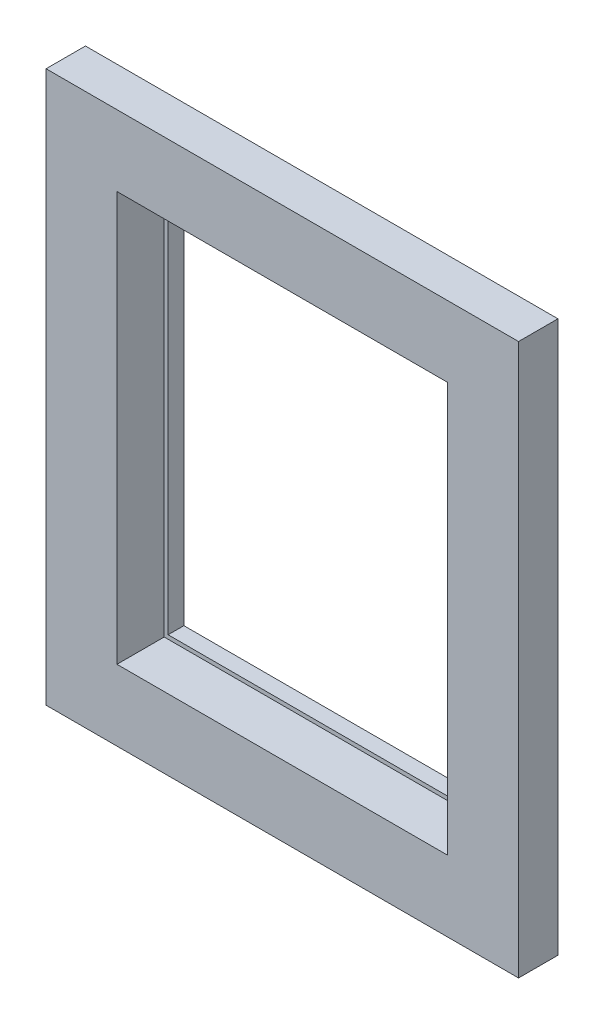
ISO-10303-21;
HEADER;
FILE_DESCRIPTION(('STEP AP214'),'2;1');
FILE_NAME('part.step','',(''),(''),'','','');
FILE_SCHEMA(('AUTOMOTIVE_DESIGN { 1 0 10303 214 1 1 1 1 }'));
ENDSEC;
DATA;
#1=APPLICATION_CONTEXT('core data for automotive mechanical design processes');
#2=APPLICATION_PROTOCOL_DEFINITION('international standard','automotive_design',2000,#1);
#3=PRODUCT_CONTEXT('',#1,'mechanical');
#4=PRODUCT('Part','Part','',(#3));
#5=PRODUCT_RELATED_PRODUCT_CATEGORY('part','',(#4));
#6=PRODUCT_DEFINITION_FORMATION('','',#4);
#7=PRODUCT_DEFINITION_CONTEXT('part definition',#1,'design');
#8=PRODUCT_DEFINITION('design','',#6,#7);
#9=PRODUCT_DEFINITION_SHAPE('','',#8);
#10=(LENGTH_UNIT() NAMED_UNIT(*) SI_UNIT(.MILLI.,.METRE.));
#11=(NAMED_UNIT(*) PLANE_ANGLE_UNIT() SI_UNIT($,.RADIAN.));
#12=(NAMED_UNIT(*) SI_UNIT($,.STERADIAN.) SOLID_ANGLE_UNIT());
#13=UNCERTAINTY_MEASURE_WITH_UNIT(LENGTH_MEASURE(1.E-05),#10,'distance_accuracy_value','');
#14=(GEOMETRIC_REPRESENTATION_CONTEXT(3) GLOBAL_UNCERTAINTY_ASSIGNED_CONTEXT((#13)) GLOBAL_UNIT_ASSIGNED_CONTEXT((#10,
#11,#12)) REPRESENTATION_CONTEXT('',''));
#15=CARTESIAN_POINT('',(0.,0.,0.));
#16=DIRECTION('',(0.,0.,1.));
#17=DIRECTION('',(1.,0.,0.));
#18=AXIS2_PLACEMENT_3D('',#15,#16,#17);
#19=CARTESIAN_POINT('',(30.,-35.,-2.));
#20=DIRECTION('',(1.,0.,0.));
#21=DIRECTION('',(0.,1.,0.));
#22=AXIS2_PLACEMENT_3D('',#19,#20,#21);
#23=PLANE('',#22);
#24=DIRECTION('',(0.,0.,1.));
#25=VECTOR('',#24,1.);
#26=CARTESIAN_POINT('',(30.,-35.,-2.));
#27=LINE('',#26,#25);
#28=CARTESIAN_POINT('',(30.,-35.,1.));
#29=VERTEX_POINT('',#28);
#30=CARTESIAN_POINT('',(30.,-35.,6.));
#31=VERTEX_POINT('',#30);
#32=EDGE_CURVE('E274',#29,#31,#27,.T.);
#33=ORIENTED_EDGE('',*,*,#32,.F.);
#34=DIRECTION('',(0.,1.,0.));
#35=VECTOR('',#34,1.);
#36=CARTESIAN_POINT('',(30.,-35.,1.));
#37=LINE('',#36,#35);
#38=CARTESIAN_POINT('',(30.,35.,1.));
#39=VERTEX_POINT('',#38);
#40=EDGE_CURVE('E166',#29,#39,#37,.T.);
#41=ORIENTED_EDGE('',*,*,#40,.T.);
#42=DIRECTION('',(0.,0.,1.));
#43=VECTOR('',#42,1.);
#44=CARTESIAN_POINT('',(30.,35.,-2.));
#45=LINE('',#44,#43);
#46=CARTESIAN_POINT('',(30.,35.,6.));
#47=VERTEX_POINT('',#46);
#48=EDGE_CURVE('E265',#39,#47,#45,.T.);
#49=ORIENTED_EDGE('',*,*,#48,.T.);
#50=DIRECTION('',(0.,1.,0.));
#51=VECTOR('',#50,1.);
#52=CARTESIAN_POINT('',(30.,-35.,6.));
#53=LINE('',#52,#51);
#54=EDGE_CURVE('E237',#31,#47,#53,.T.);
#55=ORIENTED_EDGE('',*,*,#54,.F.);
#56=EDGE_LOOP('',(#33,#41,#49,#55));
#57=FACE_BOUND('',#56,.T.);
#58=ADVANCED_FACE('F33',(#57),#23,.T.);
#59=CARTESIAN_POINT('',(-30.,-35.,-2.));
#60=DIRECTION('',(0.,-1.,0.));
#61=DIRECTION('',(0.,0.,-1.));
#62=AXIS2_PLACEMENT_3D('',#59,#60,#61);
#63=PLANE('',#62);
#64=DIRECTION('',(0.,0.,1.));
#65=VECTOR('',#64,1.);
#66=CARTESIAN_POINT('',(-30.,-35.,-2.));
#67=LINE('',#66,#65);
#68=CARTESIAN_POINT('',(-30.,-35.,1.));
#69=VERTEX_POINT('',#68);
#70=CARTESIAN_POINT('',(-30.,-35.,6.));
#71=VERTEX_POINT('',#70);
#72=EDGE_CURVE('E277',#69,#71,#67,.T.);
#73=ORIENTED_EDGE('',*,*,#72,.F.);
#74=DIRECTION('',(1.,0.,0.));
#75=VECTOR('',#74,1.);
#76=CARTESIAN_POINT('',(-30.,-35.,1.));
#77=LINE('',#76,#75);
#78=EDGE_CURVE('E156',#69,#29,#77,.T.);
#79=ORIENTED_EDGE('',*,*,#78,.T.);
#80=ORIENTED_EDGE('',*,*,#32,.T.);
#81=DIRECTION('',(1.,0.,0.));
#82=VECTOR('',#81,1.);
#83=CARTESIAN_POINT('',(-30.,-35.,6.));
#84=LINE('',#83,#82);
#85=EDGE_CURVE('E246',#71,#31,#84,.T.);
#86=ORIENTED_EDGE('',*,*,#85,.F.);
#87=EDGE_LOOP('',(#73,#79,#80,#86));
#88=FACE_BOUND('',#87,.T.);
#89=ADVANCED_FACE('F334',(#88),#63,.T.);
#90=CARTESIAN_POINT('',(-30.,-35.,-2.));
#91=DIRECTION('',(-1.,0.,0.));
#92=DIRECTION('',(0.,0.,1.));
#93=AXIS2_PLACEMENT_3D('',#90,#91,#92);
#94=PLANE('',#93);
#95=DIRECTION('',(0.,0.,1.));
#96=VECTOR('',#95,1.);
#97=CARTESIAN_POINT('',(-30.,35.,-2.));
#98=LINE('',#97,#96);
#99=CARTESIAN_POINT('',(-30.,35.,1.));
#100=VERTEX_POINT('',#99);
#101=CARTESIAN_POINT('',(-30.,35.,6.));
#102=VERTEX_POINT('',#101);
#103=EDGE_CURVE('E279',#100,#102,#98,.T.);
#104=ORIENTED_EDGE('',*,*,#103,.F.);
#105=DIRECTION('',(0.,-1.,0.));
#106=VECTOR('',#105,1.);
#107=CARTESIAN_POINT('',(-30.,35.,1.));
#108=LINE('',#107,#106);
#109=EDGE_CURVE('E173',#100,#69,#108,.T.);
#110=ORIENTED_EDGE('',*,*,#109,.T.);
#111=ORIENTED_EDGE('',*,*,#72,.T.);
#112=DIRECTION('',(0.,-1.,0.));
#113=VECTOR('',#112,1.);
#114=CARTESIAN_POINT('',(-30.,-35.,6.));
#115=LINE('',#114,#113);
#116=EDGE_CURVE('E243',#102,#71,#115,.T.);
#117=ORIENTED_EDGE('',*,*,#116,.F.);
#118=EDGE_LOOP('',(#104,#110,#111,#117));
#119=FACE_BOUND('',#118,.T.);
#120=ADVANCED_FACE('F340',(#119),#94,.T.);
#121=CARTESIAN_POINT('',(-30.,35.,-2.));
#122=DIRECTION('',(0.,1.,0.));
#123=DIRECTION('',(0.,0.,1.));
#124=AXIS2_PLACEMENT_3D('',#121,#122,#123);
#125=PLANE('',#124);
#126=ORIENTED_EDGE('',*,*,#48,.F.);
#127=DIRECTION('',(-1.,0.,0.));
#128=VECTOR('',#127,1.);
#129=CARTESIAN_POINT('',(30.,35.,1.));
#130=LINE('',#129,#128);
#131=EDGE_CURVE('E184',#39,#100,#130,.T.);
#132=ORIENTED_EDGE('',*,*,#131,.T.);
#133=ORIENTED_EDGE('',*,*,#103,.T.);
#134=DIRECTION('',(-1.,0.,0.));
#135=VECTOR('',#134,1.);
#136=CARTESIAN_POINT('',(-30.,35.,6.));
#137=LINE('',#136,#135);
#138=EDGE_CURVE('E240',#47,#102,#137,.T.);
#139=ORIENTED_EDGE('',*,*,#138,.F.);
#140=EDGE_LOOP('',(#126,#132,#133,#139));
#141=FACE_BOUND('',#140,.T.);
#142=ADVANCED_FACE('F301',(#141),#125,.T.);
#143=CARTESIAN_POINT('',(0.,0.,-2.));
#144=DIRECTION('',(0.,0.,-1.));
#145=DIRECTION('',(-1.,0.,0.));
#146=AXIS2_PLACEMENT_3D('',#143,#144,#145);
#147=PLANE('',#146);
#148=DIRECTION('',(0.,1.,0.));
#149=VECTOR('',#148,1.);
#150=CARTESIAN_POINT('',(-23.,0.,-2.));
#151=LINE('',#150,#149);
#152=CARTESIAN_POINT('',(-23.,-28.,-2.));
#153=VERTEX_POINT('',#152);
#154=CARTESIAN_POINT('',(-23.,28.,-2.));
#155=VERTEX_POINT('',#154);
#156=EDGE_CURVE('E42',#153,#155,#151,.T.);
#157=ORIENTED_EDGE('',*,*,#156,.T.);
#158=DIRECTION('',(1.,0.,0.));
#159=VECTOR('',#158,1.);
#160=CARTESIAN_POINT('',(0.,28.,-2.));
#161=LINE('',#160,#159);
#162=CARTESIAN_POINT('',(23.,28.,-2.));
#163=VERTEX_POINT('',#162);
#164=EDGE_CURVE('E11',#155,#163,#161,.T.);
#165=ORIENTED_EDGE('',*,*,#164,.T.);
#166=DIRECTION('',(0.,-1.,0.));
#167=VECTOR('',#166,1.);
#168=CARTESIAN_POINT('',(23.,0.,-2.));
#169=LINE('',#168,#167);
#170=CARTESIAN_POINT('',(23.,-28.,-2.));
#171=VERTEX_POINT('',#170);
#172=EDGE_CURVE('E284',#163,#171,#169,.T.);
#173=ORIENTED_EDGE('',*,*,#172,.T.);
#174=DIRECTION('',(-1.,0.,0.));
#175=VECTOR('',#174,1.);
#176=CARTESIAN_POINT('',(0.,-28.,-2.));
#177=LINE('',#176,#175);
#178=EDGE_CURVE('E53',#171,#153,#177,.T.);
#179=ORIENTED_EDGE('',*,*,#178,.T.);
#180=EDGE_LOOP('',(#157,#165,#173,#179));
#181=FACE_BOUND('',#180,.T.);
#182=DIRECTION('',(0.,1.,0.));
#183=VECTOR('',#182,1.);
#184=CARTESIAN_POINT('',(20.5,-25.5,-2.));
#185=LINE('',#184,#183);
#186=CARTESIAN_POINT('',(20.5,-25.5,-2.));
#187=VERTEX_POINT('',#186);
#188=CARTESIAN_POINT('',(20.5,25.5,-2.));
#189=VERTEX_POINT('',#188);
#190=EDGE_CURVE('E249',#187,#189,#185,.T.);
#191=ORIENTED_EDGE('',*,*,#190,.T.);
#192=DIRECTION('',(-1.,0.,0.));
#193=VECTOR('',#192,1.);
#194=CARTESIAN_POINT('',(-20.5,25.5,-2.));
#195=LINE('',#194,#193);
#196=CARTESIAN_POINT('',(-20.5,25.5,-2.));
#197=VERTEX_POINT('',#196);
#198=EDGE_CURVE('E252',#189,#197,#195,.T.);
#199=ORIENTED_EDGE('',*,*,#198,.T.);
#200=DIRECTION('',(0.,-1.,0.));
#201=VECTOR('',#200,1.);
#202=CARTESIAN_POINT('',(-20.5,-25.5,-2.));
#203=LINE('',#202,#201);
#204=CARTESIAN_POINT('',(-20.5,-25.5,-2.));
#205=VERTEX_POINT('',#204);
#206=EDGE_CURVE('E255',#197,#205,#203,.T.);
#207=ORIENTED_EDGE('',*,*,#206,.T.);
#208=DIRECTION('',(1.,0.,0.));
#209=VECTOR('',#208,1.);
#210=CARTESIAN_POINT('',(-20.5,-25.5,-2.));
#211=LINE('',#210,#209);
#212=EDGE_CURVE('E258',#205,#187,#211,.T.);
#213=ORIENTED_EDGE('',*,*,#212,.T.);
#214=EDGE_LOOP('',(#191,#199,#207,#213));
#215=FACE_BOUND('',#214,.T.);
#216=ADVANCED_FACE('F297',(#181,#215),#147,.T.);
#217=CARTESIAN_POINT('',(20.5,-25.5,-2.));
#218=DIRECTION('',(1.,0.,0.));
#219=DIRECTION('',(0.,0.,-1.));
#220=AXIS2_PLACEMENT_3D('',#217,#218,#219);
#221=PLANE('',#220);
#222=DIRECTION('',(0.,0.,1.));
#223=VECTOR('',#222,1.);
#224=CARTESIAN_POINT('',(20.5,-25.5,-2.));
#225=LINE('',#224,#223);
#226=CARTESIAN_POINT('',(20.5,-25.5,0.));
#227=VERTEX_POINT('',#226);
#228=EDGE_CURVE('E262',#187,#227,#225,.T.);
#229=ORIENTED_EDGE('',*,*,#228,.T.);
#230=DIRECTION('',(0.,1.,0.));
#231=VECTOR('',#230,1.);
#232=CARTESIAN_POINT('',(20.5,-25.5,0.));
#233=LINE('',#232,#231);
#234=CARTESIAN_POINT('',(20.5,25.5,0.));
#235=VERTEX_POINT('',#234);
#236=EDGE_CURVE('E234',#227,#235,#233,.T.);
#237=ORIENTED_EDGE('',*,*,#236,.T.);
#238=DIRECTION('',(0.,0.,1.));
#239=VECTOR('',#238,1.);
#240=CARTESIAN_POINT('',(20.5,25.5,-2.));
#241=LINE('',#240,#239);
#242=EDGE_CURVE('E261',#189,#235,#241,.T.);
#243=ORIENTED_EDGE('',*,*,#242,.F.);
#244=ORIENTED_EDGE('',*,*,#190,.F.);
#245=EDGE_LOOP('',(#229,#237,#243,#244));
#246=FACE_BOUND('',#245,.T.);
#247=ADVANCED_FACE('F300',(#246),#221,.F.);
#248=CARTESIAN_POINT('',(-20.5,-25.5,-2.));
#249=DIRECTION('',(0.,-1.,0.));
#250=DIRECTION('',(0.,0.,-1.));
#251=AXIS2_PLACEMENT_3D('',#248,#249,#250);
#252=PLANE('',#251);
#253=DIRECTION('',(0.,0.,1.));
#254=VECTOR('',#253,1.);
#255=CARTESIAN_POINT('',(-20.5,-25.5,-2.));
#256=LINE('',#255,#254);
#257=CARTESIAN_POINT('',(-20.5,-25.5,0.));
#258=VERTEX_POINT('',#257);
#259=EDGE_CURVE('E266',#205,#258,#256,.T.);
#260=ORIENTED_EDGE('',*,*,#259,.T.);
#261=DIRECTION('',(1.,0.,0.));
#262=VECTOR('',#261,1.);
#263=CARTESIAN_POINT('',(-20.5,-25.5,0.));
#264=LINE('',#263,#262);
#265=EDGE_CURVE('E231',#258,#227,#264,.T.);
#266=ORIENTED_EDGE('',*,*,#265,.T.);
#267=ORIENTED_EDGE('',*,*,#228,.F.);
#268=ORIENTED_EDGE('',*,*,#212,.F.);
#269=EDGE_LOOP('',(#260,#266,#267,#268));
#270=FACE_BOUND('',#269,.T.);
#271=ADVANCED_FACE('F313',(#270),#252,.F.);
#272=CARTESIAN_POINT('',(-20.5,-25.5,-2.));
#273=DIRECTION('',(-1.,0.,0.));
#274=DIRECTION('',(0.,0.,1.));
#275=AXIS2_PLACEMENT_3D('',#272,#273,#274);
#276=PLANE('',#275);
#277=DIRECTION('',(0.,0.,1.));
#278=VECTOR('',#277,1.);
#279=CARTESIAN_POINT('',(-20.5,25.5,-2.));
#280=LINE('',#279,#278);
#281=CARTESIAN_POINT('',(-20.5,25.5,0.));
#282=VERTEX_POINT('',#281);
#283=EDGE_CURVE('E269',#197,#282,#280,.T.);
#284=ORIENTED_EDGE('',*,*,#283,.T.);
#285=DIRECTION('',(0.,-1.,0.));
#286=VECTOR('',#285,1.);
#287=CARTESIAN_POINT('',(-20.5,-25.5,0.));
#288=LINE('',#287,#286);
#289=EDGE_CURVE('E223',#282,#258,#288,.T.);
#290=ORIENTED_EDGE('',*,*,#289,.T.);
#291=ORIENTED_EDGE('',*,*,#259,.F.);
#292=ORIENTED_EDGE('',*,*,#206,.F.);
#293=EDGE_LOOP('',(#284,#290,#291,#292));
#294=FACE_BOUND('',#293,.T.);
#295=ADVANCED_FACE('F311',(#294),#276,.F.);
#296=CARTESIAN_POINT('',(-20.5,25.5,-2.));
#297=DIRECTION('',(0.,1.,0.));
#298=DIRECTION('',(0.,0.,1.));
#299=AXIS2_PLACEMENT_3D('',#296,#297,#298);
#300=PLANE('',#299);
#301=ORIENTED_EDGE('',*,*,#242,.T.);
#302=DIRECTION('',(-1.,0.,0.));
#303=VECTOR('',#302,1.);
#304=CARTESIAN_POINT('',(-20.5,25.5,0.));
#305=LINE('',#304,#303);
#306=EDGE_CURVE('E276',#235,#282,#305,.T.);
#307=ORIENTED_EDGE('',*,*,#306,.T.);
#308=ORIENTED_EDGE('',*,*,#283,.F.);
#309=ORIENTED_EDGE('',*,*,#198,.F.);
#310=EDGE_LOOP('',(#301,#307,#308,#309));
#311=FACE_BOUND('',#310,.T.);
#312=ADVANCED_FACE('F309',(#311),#300,.F.);
#313=CARTESIAN_POINT('',(0.,0.,6.));
#314=DIRECTION('',(0.,0.,-1.));
#315=DIRECTION('',(-1.,0.,0.));
#316=AXIS2_PLACEMENT_3D('',#313,#314,#315);
#317=PLANE('',#316);
#318=DIRECTION('',(-1.,0.,0.));
#319=VECTOR('',#318,1.);
#320=CARTESIAN_POINT('',(21.,-26.,6.));
#321=LINE('',#320,#319);
#322=CARTESIAN_POINT('',(21.,-26.,6.));
#323=VERTEX_POINT('',#322);
#324=CARTESIAN_POINT('',(-21.,-26.,6.));
#325=VERTEX_POINT('',#324);
#326=EDGE_CURVE('E207',#323,#325,#321,.T.);
#327=ORIENTED_EDGE('',*,*,#326,.T.);
#328=DIRECTION('',(0.,1.,0.));
#329=VECTOR('',#328,1.);
#330=CARTESIAN_POINT('',(-21.,26.,6.));
#331=LINE('',#330,#329);
#332=CARTESIAN_POINT('',(-21.,26.,6.));
#333=VERTEX_POINT('',#332);
#334=EDGE_CURVE('E197',#325,#333,#331,.T.);
#335=ORIENTED_EDGE('',*,*,#334,.T.);
#336=DIRECTION('',(1.,0.,0.));
#337=VECTOR('',#336,1.);
#338=CARTESIAN_POINT('',(21.,26.,6.));
#339=LINE('',#338,#337);
#340=CARTESIAN_POINT('',(21.,26.,6.));
#341=VERTEX_POINT('',#340);
#342=EDGE_CURVE('E200',#333,#341,#339,.T.);
#343=ORIENTED_EDGE('',*,*,#342,.T.);
#344=DIRECTION('',(0.,-1.,0.));
#345=VECTOR('',#344,1.);
#346=CARTESIAN_POINT('',(21.,26.,6.));
#347=LINE('',#346,#345);
#348=EDGE_CURVE('E204',#341,#323,#347,.T.);
#349=ORIENTED_EDGE('',*,*,#348,.T.);
#350=EDGE_LOOP('',(#327,#335,#343,#349));
#351=FACE_BOUND('',#350,.T.);
#352=ORIENTED_EDGE('',*,*,#54,.T.);
#353=ORIENTED_EDGE('',*,*,#138,.T.);
#354=ORIENTED_EDGE('',*,*,#116,.T.);
#355=ORIENTED_EDGE('',*,*,#85,.T.);
#356=EDGE_LOOP('',(#352,#353,#354,#355));
#357=FACE_BOUND('',#356,.T.);
#358=ADVANCED_FACE('F318',(#351,#357),#317,.F.);
#359=CARTESIAN_POINT('',(0.,0.,0.));
#360=DIRECTION('',(0.,0.,-1.));
#361=DIRECTION('',(-1.,0.,0.));
#362=AXIS2_PLACEMENT_3D('',#359,#360,#361);
#363=PLANE('',#362);
#364=DIRECTION('',(0.,1.,0.));
#365=VECTOR('',#364,1.);
#366=CARTESIAN_POINT('',(-21.,26.,0.));
#367=LINE('',#366,#365);
#368=CARTESIAN_POINT('',(-21.,-26.,0.));
#369=VERTEX_POINT('',#368);
#370=CARTESIAN_POINT('',(-21.,26.,0.));
#371=VERTEX_POINT('',#370);
#372=EDGE_CURVE('E180',#369,#371,#367,.T.);
#373=ORIENTED_EDGE('',*,*,#372,.F.);
#374=DIRECTION('',(-1.,0.,0.));
#375=VECTOR('',#374,1.);
#376=CARTESIAN_POINT('',(21.,-26.,0.));
#377=LINE('',#376,#375);
#378=CARTESIAN_POINT('',(21.,-26.,0.));
#379=VERTEX_POINT('',#378);
#380=EDGE_CURVE('E201',#379,#369,#377,.T.);
#381=ORIENTED_EDGE('',*,*,#380,.F.);
#382=DIRECTION('',(0.,-1.,0.));
#383=VECTOR('',#382,1.);
#384=CARTESIAN_POINT('',(21.,26.,0.));
#385=LINE('',#384,#383);
#386=CARTESIAN_POINT('',(21.,26.,0.));
#387=VERTEX_POINT('',#386);
#388=EDGE_CURVE('E216',#387,#379,#385,.T.);
#389=ORIENTED_EDGE('',*,*,#388,.F.);
#390=DIRECTION('',(1.,0.,0.));
#391=VECTOR('',#390,1.);
#392=CARTESIAN_POINT('',(21.,26.,0.));
#393=LINE('',#392,#391);
#394=EDGE_CURVE('E213',#371,#387,#393,.T.);
#395=ORIENTED_EDGE('',*,*,#394,.F.);
#396=EDGE_LOOP('',(#373,#381,#389,#395));
#397=FACE_BOUND('',#396,.T.);
#398=ORIENTED_EDGE('',*,*,#265,.F.);
#399=ORIENTED_EDGE('',*,*,#289,.F.);
#400=ORIENTED_EDGE('',*,*,#306,.F.);
#401=ORIENTED_EDGE('',*,*,#236,.F.);
#402=EDGE_LOOP('',(#398,#399,#400,#401));
#403=FACE_BOUND('',#402,.T.);
#404=ADVANCED_FACE('F315',(#397,#403),#363,.F.);
#405=CARTESIAN_POINT('',(-21.,26.,6.));
#406=DIRECTION('',(-1.,0.,0.));
#407=DIRECTION('',(0.,-1.,0.));
#408=AXIS2_PLACEMENT_3D('',#405,#406,#407);
#409=PLANE('',#408);
#410=ORIENTED_EDGE('',*,*,#372,.T.);
#411=DIRECTION('',(0.,0.,-1.));
#412=VECTOR('',#411,1.);
#413=CARTESIAN_POINT('',(-21.,26.,6.));
#414=LINE('',#413,#412);
#415=EDGE_CURVE('E210',#333,#371,#414,.T.);
#416=ORIENTED_EDGE('',*,*,#415,.F.);
#417=ORIENTED_EDGE('',*,*,#334,.F.);
#418=DIRECTION('',(0.,0.,-1.));
#419=VECTOR('',#418,1.);
#420=CARTESIAN_POINT('',(-21.,-26.,6.));
#421=LINE('',#420,#419);
#422=EDGE_CURVE('E221',#325,#369,#421,.T.);
#423=ORIENTED_EDGE('',*,*,#422,.T.);
#424=EDGE_LOOP('',(#410,#416,#417,#423));
#425=FACE_BOUND('',#424,.T.);
#426=ADVANCED_FACE('F317',(#425),#409,.F.);
#427=CARTESIAN_POINT('',(21.,-26.,6.));
#428=DIRECTION('',(0.,-1.,0.));
#429=DIRECTION('',(0.,0.,-1.));
#430=AXIS2_PLACEMENT_3D('',#427,#428,#429);
#431=PLANE('',#430);
#432=ORIENTED_EDGE('',*,*,#380,.T.);
#433=ORIENTED_EDGE('',*,*,#422,.F.);
#434=ORIENTED_EDGE('',*,*,#326,.F.);
#435=DIRECTION('',(0.,0.,-1.));
#436=VECTOR('',#435,1.);
#437=CARTESIAN_POINT('',(21.,-26.,6.));
#438=LINE('',#437,#436);
#439=EDGE_CURVE('E224',#323,#379,#438,.T.);
#440=ORIENTED_EDGE('',*,*,#439,.T.);
#441=EDGE_LOOP('',(#432,#433,#434,#440));
#442=FACE_BOUND('',#441,.T.);
#443=ADVANCED_FACE('F325',(#442),#431,.F.);
#444=CARTESIAN_POINT('',(21.,26.,6.));
#445=DIRECTION('',(1.,0.,0.));
#446=DIRECTION('',(0.,1.,0.));
#447=AXIS2_PLACEMENT_3D('',#444,#445,#446);
#448=PLANE('',#447);
#449=ORIENTED_EDGE('',*,*,#388,.T.);
#450=ORIENTED_EDGE('',*,*,#439,.F.);
#451=ORIENTED_EDGE('',*,*,#348,.F.);
#452=DIRECTION('',(0.,0.,-1.));
#453=VECTOR('',#452,1.);
#454=CARTESIAN_POINT('',(21.,26.,6.));
#455=LINE('',#454,#453);
#456=EDGE_CURVE('E226',#341,#387,#455,.T.);
#457=ORIENTED_EDGE('',*,*,#456,.T.);
#458=EDGE_LOOP('',(#449,#450,#451,#457));
#459=FACE_BOUND('',#458,.T.);
#460=ADVANCED_FACE('F368',(#459),#448,.F.);
#461=CARTESIAN_POINT('',(21.,26.,6.));
#462=DIRECTION('',(0.,1.,0.));
#463=DIRECTION('',(0.,0.,1.));
#464=AXIS2_PLACEMENT_3D('',#461,#462,#463);
#465=PLANE('',#464);
#466=ORIENTED_EDGE('',*,*,#394,.T.);
#467=ORIENTED_EDGE('',*,*,#456,.F.);
#468=ORIENTED_EDGE('',*,*,#342,.F.);
#469=ORIENTED_EDGE('',*,*,#415,.T.);
#470=EDGE_LOOP('',(#466,#467,#468,#469));
#471=FACE_BOUND('',#470,.T.);
#472=ADVANCED_FACE('F360',(#471),#465,.F.);
#473=CARTESIAN_POINT('',(-30.,35.,1.));
#474=DIRECTION('',(0.,0.,-1.));
#475=DIRECTION('',(-1.,0.,0.));
#476=AXIS2_PLACEMENT_3D('',#473,#474,#475);
#477=PLANE('',#476);
#478=DIRECTION('',(0.,-1.,0.));
#479=VECTOR('',#478,1.);
#480=CARTESIAN_POINT('',(-26.,35.,1.));
#481=LINE('',#480,#479);
#482=CARTESIAN_POINT('',(-26.,31.,1.));
#483=VERTEX_POINT('',#482);
#484=CARTESIAN_POINT('',(-26.,-31.,1.));
#485=VERTEX_POINT('',#484);
#486=EDGE_CURVE('E192',#483,#485,#481,.T.);
#487=ORIENTED_EDGE('',*,*,#486,.T.);
#488=DIRECTION('',(-0.707106781186548,-0.707106781186548,0.));
#489=VECTOR('',#488,1.);
#490=CARTESIAN_POINT('',(-30.,-35.,1.));
#491=LINE('',#490,#489);
#492=EDGE_CURVE('E152',#485,#69,#491,.T.);
#493=ORIENTED_EDGE('',*,*,#492,.T.);
#494=ORIENTED_EDGE('',*,*,#109,.F.);
#495=DIRECTION('',(-0.707106781186548,0.707106781186548,0.));
#496=VECTOR('',#495,1.);
#497=CARTESIAN_POINT('',(0.,4.99999999999999,1.));
#498=LINE('',#497,#496);
#499=EDGE_CURVE('E187',#483,#100,#498,.T.);
#500=ORIENTED_EDGE('',*,*,#499,.F.);
#501=EDGE_LOOP('',(#487,#493,#494,#500));
#502=FACE_BOUND('',#501,.T.);
#503=ADVANCED_FACE('F354',(#502),#477,.T.);
#504=CARTESIAN_POINT('',(-30.,-35.,1.));
#505=DIRECTION('',(0.,0.,-1.));
#506=DIRECTION('',(-1.,0.,0.));
#507=AXIS2_PLACEMENT_3D('',#504,#505,#506);
#508=PLANE('',#507);
#509=DIRECTION('',(1.,0.,0.));
#510=VECTOR('',#509,1.);
#511=CARTESIAN_POINT('',(-30.,-31.,1.));
#512=LINE('',#511,#510);
#513=CARTESIAN_POINT('',(26.,-31.,1.));
#514=VERTEX_POINT('',#513);
#515=EDGE_CURVE('E146',#485,#514,#512,.T.);
#516=ORIENTED_EDGE('',*,*,#515,.T.);
#517=DIRECTION('',(0.707106781186548,-0.707106781186548,0.));
#518=VECTOR('',#517,1.);
#519=CARTESIAN_POINT('',(30.,-35.,1.));
#520=LINE('',#519,#518);
#521=EDGE_CURVE('E150',#514,#29,#520,.T.);
#522=ORIENTED_EDGE('',*,*,#521,.T.);
#523=ORIENTED_EDGE('',*,*,#78,.F.);
#524=ORIENTED_EDGE('',*,*,#492,.F.);
#525=EDGE_LOOP('',(#516,#522,#523,#524));
#526=FACE_BOUND('',#525,.T.);
#527=ADVANCED_FACE('F148',(#526),#508,.T.);
#528=CARTESIAN_POINT('',(30.,35.,1.));
#529=DIRECTION('',(0.,0.,-1.));
#530=DIRECTION('',(-1.,0.,0.));
#531=AXIS2_PLACEMENT_3D('',#528,#529,#530);
#532=PLANE('',#531);
#533=DIRECTION('',(-1.,0.,0.));
#534=VECTOR('',#533,1.);
#535=CARTESIAN_POINT('',(30.,31.,1.));
#536=LINE('',#535,#534);
#537=CARTESIAN_POINT('',(26.,31.,1.));
#538=VERTEX_POINT('',#537);
#539=EDGE_CURVE('E168',#538,#483,#536,.T.);
#540=ORIENTED_EDGE('',*,*,#539,.T.);
#541=ORIENTED_EDGE('',*,*,#499,.T.);
#542=ORIENTED_EDGE('',*,*,#131,.F.);
#543=DIRECTION('',(0.707106781186548,0.707106781186548,0.));
#544=VECTOR('',#543,1.);
#545=CARTESIAN_POINT('',(-4.99999999999999,0.,1.));
#546=LINE('',#545,#544);
#547=EDGE_CURVE('E178',#538,#39,#546,.T.);
#548=ORIENTED_EDGE('',*,*,#547,.F.);
#549=EDGE_LOOP('',(#540,#541,#542,#548));
#550=FACE_BOUND('',#549,.T.);
#551=ADVANCED_FACE('F358',(#550),#532,.T.);
#552=CARTESIAN_POINT('',(30.,-35.,1.));
#553=DIRECTION('',(0.,0.,-1.));
#554=DIRECTION('',(-1.,0.,0.));
#555=AXIS2_PLACEMENT_3D('',#552,#553,#554);
#556=PLANE('',#555);
#557=ORIENTED_EDGE('',*,*,#521,.F.);
#558=DIRECTION('',(0.,1.,0.));
#559=VECTOR('',#558,1.);
#560=CARTESIAN_POINT('',(26.,-35.,1.));
#561=LINE('',#560,#559);
#562=EDGE_CURVE('E163',#514,#538,#561,.T.);
#563=ORIENTED_EDGE('',*,*,#562,.T.);
#564=ORIENTED_EDGE('',*,*,#547,.T.);
#565=ORIENTED_EDGE('',*,*,#40,.F.);
#566=EDGE_LOOP('',(#557,#563,#564,#565));
#567=FACE_BOUND('',#566,.T.);
#568=ADVANCED_FACE('F160',(#567),#556,.T.);
#569=CARTESIAN_POINT('',(-30.,-31.,1.));
#570=DIRECTION('',(0.,0.707106781186547,0.707106781186547));
#571=DIRECTION('',(1.,0.,0.));
#572=AXIS2_PLACEMENT_3D('',#569,#570,#571);
#573=PLANE('',#572);
#574=DIRECTION('',(0.577350269189626,0.577350269189626,-0.577350269189626));
#575=VECTOR('',#574,1.);
#576=CARTESIAN_POINT('',(-27.3333333333333,-32.3333333333333,2.33333333333333));
#577=LINE('',#576,#575);
#578=EDGE_CURVE('E174',#153,#485,#577,.F.);
#579=ORIENTED_EDGE('',*,*,#578,.F.);
#580=ORIENTED_EDGE('',*,*,#178,.F.);
#581=DIRECTION('',(-0.577350269189626,0.577350269189626,-0.577350269189626));
#582=VECTOR('',#581,1.);
#583=CARTESIAN_POINT('',(27.3333333333333,-32.3333333333333,2.33333333333334));
#584=LINE('',#583,#582);
#585=EDGE_CURVE('E37',#514,#171,#584,.T.);
#586=ORIENTED_EDGE('',*,*,#585,.F.);
#587=ORIENTED_EDGE('',*,*,#515,.F.);
#588=EDGE_LOOP('',(#579,#580,#586,#587));
#589=FACE_BOUND('',#588,.T.);
#590=ADVANCED_FACE('F35',(#589),#573,.F.);
#591=CARTESIAN_POINT('',(26.,-35.,1.));
#592=DIRECTION('',(-0.707106781186548,0.,0.707106781186547));
#593=DIRECTION('',(0.,1.,0.));
#594=AXIS2_PLACEMENT_3D('',#591,#592,#593);
#595=PLANE('',#594);
#596=ORIENTED_EDGE('',*,*,#585,.T.);
#597=ORIENTED_EDGE('',*,*,#172,.F.);
#598=DIRECTION('',(0.577350269189626,0.577350269189626,0.577350269189626));
#599=VECTOR('',#598,1.);
#600=CARTESIAN_POINT('',(4.00000000000001,8.99999999999997,-21.));
#601=LINE('',#600,#599);
#602=EDGE_CURVE('E176',#538,#163,#601,.F.);
#603=ORIENTED_EDGE('',*,*,#602,.F.);
#604=ORIENTED_EDGE('',*,*,#562,.F.);
#605=EDGE_LOOP('',(#596,#597,#603,#604));
#606=FACE_BOUND('',#605,.T.);
#607=ADVANCED_FACE('F175',(#606),#595,.F.);
#608=CARTESIAN_POINT('',(-26.,35.,1.));
#609=DIRECTION('',(0.707106781186547,0.,0.707106781186547));
#610=DIRECTION('',(0.,-1.,0.));
#611=AXIS2_PLACEMENT_3D('',#608,#609,#610);
#612=PLANE('',#611);
#613=ORIENTED_EDGE('',*,*,#578,.T.);
#614=ORIENTED_EDGE('',*,*,#486,.F.);
#615=DIRECTION('',(0.577350269189626,-0.577350269189626,-0.577350269189626));
#616=VECTOR('',#615,1.);
#617=CARTESIAN_POINT('',(-27.3333333333333,32.3333333333333,2.33333333333334));
#618=LINE('',#617,#616);
#619=EDGE_CURVE('E288',#155,#483,#618,.F.);
#620=ORIENTED_EDGE('',*,*,#619,.F.);
#621=ORIENTED_EDGE('',*,*,#156,.F.);
#622=EDGE_LOOP('',(#613,#614,#620,#621));
#623=FACE_BOUND('',#622,.T.);
#624=ADVANCED_FACE('F292',(#623),#612,.F.);
#625=CARTESIAN_POINT('',(30.,31.,1.));
#626=DIRECTION('',(0.,-0.707106781186547,0.707106781186547));
#627=DIRECTION('',(-1.,0.,0.));
#628=AXIS2_PLACEMENT_3D('',#625,#626,#627);
#629=PLANE('',#628);
#630=ORIENTED_EDGE('',*,*,#602,.T.);
#631=ORIENTED_EDGE('',*,*,#164,.F.);
#632=ORIENTED_EDGE('',*,*,#619,.T.);
#633=ORIENTED_EDGE('',*,*,#539,.F.);
#634=EDGE_LOOP('',(#630,#631,#632,#633));
#635=FACE_BOUND('',#634,.T.);
#636=ADVANCED_FACE('F296',(#635),#629,.F.);
#637=CLOSED_SHELL('',(#58,#89,#120,#142,#216,#247,#271,#295,#312,#358,#404,#426,#443,#460,#472,
#503,#527,#551,#568,#590,#607,#624,#636));
#638=MANIFOLD_SOLID_BREP('B2',#637);
#639=ADVANCED_BREP_SHAPE_REPRESENTATION('',(#18,#638),#14);
#640=SHAPE_DEFINITION_REPRESENTATION(#9,#639);
ENDSEC;
END-ISO-10303-21;
